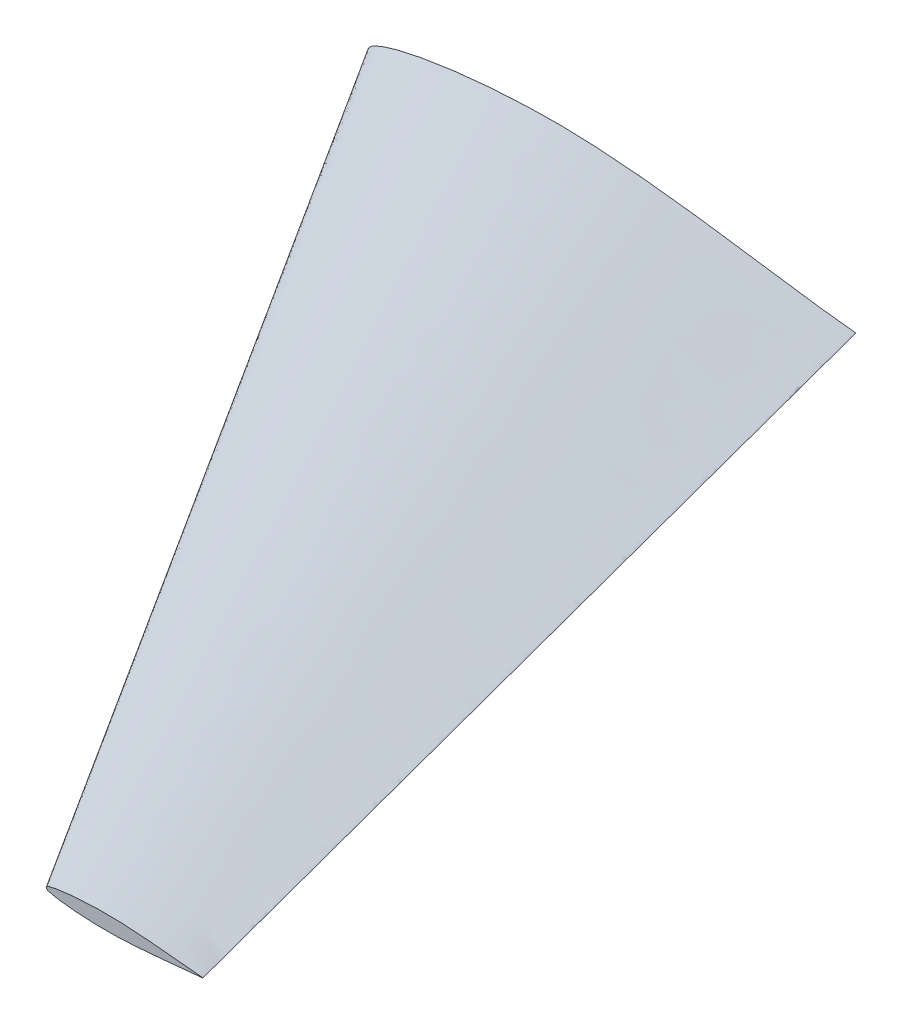
ISO-10303-21;
HEADER;
FILE_DESCRIPTION(('STEP AP214'),'2;1');
FILE_NAME('part.step','',(''),(''),'','','');
FILE_SCHEMA(('AUTOMOTIVE_DESIGN { 1 0 10303 214 1 1 1 1 }'));
ENDSEC;
DATA;
#1=APPLICATION_CONTEXT('core data for automotive mechanical design processes');
#2=APPLICATION_PROTOCOL_DEFINITION('international standard','automotive_design',2000,#1);
#3=PRODUCT_CONTEXT('',#1,'mechanical');
#4=PRODUCT('Part','Part','',(#3));
#5=PRODUCT_RELATED_PRODUCT_CATEGORY('part','',(#4));
#6=PRODUCT_DEFINITION_FORMATION('','',#4);
#7=PRODUCT_DEFINITION_CONTEXT('part definition',#1,'design');
#8=PRODUCT_DEFINITION('design','',#6,#7);
#9=PRODUCT_DEFINITION_SHAPE('','',#8);
#10=(LENGTH_UNIT() NAMED_UNIT(*) SI_UNIT(.MILLI.,.METRE.));
#11=(NAMED_UNIT(*) PLANE_ANGLE_UNIT() SI_UNIT($,.RADIAN.));
#12=(NAMED_UNIT(*) SI_UNIT($,.STERADIAN.) SOLID_ANGLE_UNIT());
#13=UNCERTAINTY_MEASURE_WITH_UNIT(LENGTH_MEASURE(1.E-05),#10,'distance_accuracy_value','');
#14=(GEOMETRIC_REPRESENTATION_CONTEXT(3) GLOBAL_UNCERTAINTY_ASSIGNED_CONTEXT((#13)) GLOBAL_UNIT_ASSIGNED_CONTEXT((#10,
#11,#12)) REPRESENTATION_CONTEXT('',''));
#15=CARTESIAN_POINT('',(0.,0.,0.));
#16=DIRECTION('',(0.,0.,1.));
#17=DIRECTION('',(1.,0.,0.));
#18=AXIS2_PLACEMENT_3D('',#15,#16,#17);
#19=CARTESIAN_POINT('',(4453.128,371.45976,6781.8));
#20=DIRECTION('',(0.,0.,-1.));
#21=DIRECTION('',(-1.,0.,0.));
#22=AXIS2_PLACEMENT_3D('',#19,#20,#21);
#23=PLANE('',#22);
#24=CARTESIAN_POINT('',(5588.08,371.45976,6781.8));
#25=CARTESIAN_POINT('',(5588.08,373.389033660394,6781.8));
#26=CARTESIAN_POINT('',(5522.56796665848,377.246958222847,6781.8));
#27=CARTESIAN_POINT('',(5476.93631004767,382.751113923314,6781.8));
#28=CARTESIAN_POINT('',(5417.20776513248,388.279371158532,6781.8));
#29=CARTESIAN_POINT('',(5361.25832589837,393.788419411056,6781.8));
#30=CARTESIAN_POINT('',(5304.30415938628,399.323068080224,6781.8));
#31=CARTESIAN_POINT('',(5247.62152230938,404.701403191757,6781.8));
#32=CARTESIAN_POINT('',(5190.86528711513,409.754791736413,6781.8));
#33=CARTESIAN_POINT('',(5134.12296543994,414.277198099908,6781.8));
#34=CARTESIAN_POINT('',(5077.37405739461,418.179025615403,6781.8));
#35=CARTESIAN_POINT('',(5020.62612912722,421.366617603054,6781.8));
#36=CARTESIAN_POINT('',(4963.873502372,423.62166755606,6781.8));
#37=CARTESIAN_POINT('',(4907.11371080945,424.783118391333,6781.8));
#38=CARTESIAN_POINT('',(4850.35264515862,424.405327799402,6781.8));
#39=CARTESIAN_POINT('',(4793.59626623108,423.014520922087,6781.8));
#40=CARTESIAN_POINT('',(4736.83720488456,420.590154546129,6781.8));
#41=CARTESIAN_POINT('',(4691.44477463074,417.780353043898,6781.8));
#42=CARTESIAN_POINT('',(4657.41011631619,415.120346995231,6781.8));
#43=CARTESIAN_POINT('',(4634.70927324186,413.121809072795,6781.8));
#44=CARTESIAN_POINT('',(4612.00715406554,410.886433711178,6781.8));
#45=CARTESIAN_POINT('',(4589.30249029939,408.381114500574,6781.8));
#46=CARTESIAN_POINT('',(4570.39022594525,406.014184388592,6781.8));
#47=CARTESIAN_POINT('',(4555.26575497689,403.898854811169,6781.8));
#48=CARTESIAN_POINT('',(4543.91478754129,402.200963084366,6781.8));
#49=CARTESIAN_POINT('',(4532.562761102,400.379871833449,6781.8));
#50=CARTESIAN_POINT('',(4521.20836085698,398.414733776014,6781.8));
#51=CARTESIAN_POINT('',(4509.85072092981,396.259854862085,6781.8));
#52=CARTESIAN_POINT('',(4498.48898179351,393.848808922471,6781.8));
#53=CARTESIAN_POINT('',(4487.10823225985,391.097498706532,6781.8));
#54=CARTESIAN_POINT('',(4475.6827064702,387.804436569271,6781.8));
#55=CARTESIAN_POINT('',(4467.94512337229,384.986164054341,6781.8));
#56=CARTESIAN_POINT('',(4463.90866818526,383.051037549598,6781.8));
#57=CARTESIAN_POINT('',(4463.3402459786,382.772373867734,6781.8));
#58=CARTESIAN_POINT('',(4462.77383813084,382.481228969844,6781.8));
#59=CARTESIAN_POINT('',(4462.20468037223,382.18506692914,6781.8));
#60=CARTESIAN_POINT('',(4461.6383932521,381.873595370281,6781.8));
#61=CARTESIAN_POINT('',(4461.06920179731,381.554932023186,6781.8));
#62=CARTESIAN_POINT('',(4460.50237042468,381.219330431199,6781.8));
#63=CARTESIAN_POINT('',(4459.93317268583,380.87163669184,6781.8));
#64=CARTESIAN_POINT('',(4459.36608721299,380.503126930761,6781.8));
#65=CARTESIAN_POINT('',(4458.79624417143,380.116974740003,6781.8));
#66=CARTESIAN_POINT('',(4458.22908740877,379.702707947539,6781.8));
#67=CARTESIAN_POINT('',(4457.65978663277,379.262562113939,6781.8));
#68=CARTESIAN_POINT('',(4457.08950106512,378.788749250087,6781.8));
#69=CARTESIAN_POINT('',(4456.51963706104,378.270985507122,6781.8));
#70=CARTESIAN_POINT('',(4456.0521212618,377.801218074383,6781.8));
#71=CARTESIAN_POINT('',(4455.67541266046,377.398000449587,6781.8));
#72=CARTESIAN_POINT('',(4455.39345946141,377.067902590402,6781.8));
#73=CARTESIAN_POINT('',(4455.10588602049,376.717223822734,6781.8));
#74=CARTESIAN_POINT('',(4454.82351786847,376.334358412567,6781.8));
#75=CARTESIAN_POINT('',(4454.533910329,375.917381821102,6781.8));
#76=CARTESIAN_POINT('',(4454.250165846,375.447179964608,6781.8));
#77=CARTESIAN_POINT('',(4453.95907316831,374.908874378052,6781.8));
#78=CARTESIAN_POINT('',(4453.65957079658,374.248591593124,6781.8));
#79=CARTESIAN_POINT('',(4453.27379611439,373.110554852125,6781.8));
#80=CARTESIAN_POINT('',(4453.026428463,371.45976,6781.8));
#81=CARTESIAN_POINT('',(4453.27379611439,369.808965147876,6781.8));
#82=CARTESIAN_POINT('',(4453.65957079658,368.670928406876,6781.8));
#83=CARTESIAN_POINT('',(4453.95907316831,368.010645621949,6781.8));
#84=CARTESIAN_POINT('',(4454.250165846,367.472340035392,6781.8));
#85=CARTESIAN_POINT('',(4454.533910329,367.002138178898,6781.8));
#86=CARTESIAN_POINT('',(4454.82351786847,366.585161587433,6781.8));
#87=CARTESIAN_POINT('',(4455.10588602049,366.202296177266,6781.8));
#88=CARTESIAN_POINT('',(4455.39345946141,365.851617409598,6781.8));
#89=CARTESIAN_POINT('',(4455.67541266046,365.521519550413,6781.8));
#90=CARTESIAN_POINT('',(4456.0521212618,365.118301925617,6781.8));
#91=CARTESIAN_POINT('',(4456.51963706104,364.648534492878,6781.8));
#92=CARTESIAN_POINT('',(4457.08950106512,364.130770749913,6781.8));
#93=CARTESIAN_POINT('',(4457.65978663277,363.656957886061,6781.8));
#94=CARTESIAN_POINT('',(4458.22908740877,363.216812052461,6781.8));
#95=CARTESIAN_POINT('',(4458.79624417143,362.802545259997,6781.8));
#96=CARTESIAN_POINT('',(4459.36608721299,362.416393069239,6781.8));
#97=CARTESIAN_POINT('',(4459.93317268583,362.047883308161,6781.8));
#98=CARTESIAN_POINT('',(4460.50237042468,361.700189568801,6781.8));
#99=CARTESIAN_POINT('',(4461.06920179731,361.364587976814,6781.8));
#100=CARTESIAN_POINT('',(4461.6383932521,361.045924629719,6781.8));
#101=CARTESIAN_POINT('',(4462.20468037223,360.73445307086,6781.8));
#102=CARTESIAN_POINT('',(4462.77383813084,360.438291030156,6781.8));
#103=CARTESIAN_POINT('',(4463.3402459786,360.147146132266,6781.8));
#104=CARTESIAN_POINT('',(4463.90866818526,359.868482450402,6781.8));
#105=CARTESIAN_POINT('',(4467.94512337229,357.933355945659,6781.8));
#106=CARTESIAN_POINT('',(4475.6827064702,355.115083430729,6781.8));
#107=CARTESIAN_POINT('',(4487.10823225985,351.822021293468,6781.8));
#108=CARTESIAN_POINT('',(4498.48898179351,349.070711077529,6781.8));
#109=CARTESIAN_POINT('',(4509.85072092981,346.659665137915,6781.8));
#110=CARTESIAN_POINT('',(4521.20836085698,344.504786223986,6781.8));
#111=CARTESIAN_POINT('',(4532.562761102,342.539648166551,6781.8));
#112=CARTESIAN_POINT('',(4543.91478754129,340.718556915634,6781.8));
#113=CARTESIAN_POINT('',(4555.26575497689,339.020665188831,6781.8));
#114=CARTESIAN_POINT('',(4570.39022594525,336.905335611408,6781.8));
#115=CARTESIAN_POINT('',(4589.30249029939,334.538405499426,6781.8));
#116=CARTESIAN_POINT('',(4612.00715406554,332.033086288822,6781.8));
#117=CARTESIAN_POINT('',(4634.70927324186,329.797710927205,6781.8));
#118=CARTESIAN_POINT('',(4657.41011631619,327.799173004769,6781.8));
#119=CARTESIAN_POINT('',(4691.44477463074,325.139166956102,6781.8));
#120=CARTESIAN_POINT('',(4736.83720488456,322.329365453871,6781.8));
#121=CARTESIAN_POINT('',(4793.59626623108,319.904999077913,6781.8));
#122=CARTESIAN_POINT('',(4850.35264515862,318.514192200598,6781.8));
#123=CARTESIAN_POINT('',(4907.11371080946,318.136401608667,6781.8));
#124=CARTESIAN_POINT('',(4963.873502372,319.29785244394,6781.8));
#125=CARTESIAN_POINT('',(5020.62612912722,321.552902396946,6781.8));
#126=CARTESIAN_POINT('',(5077.37405739461,324.740494384597,6781.8));
#127=CARTESIAN_POINT('',(5134.12296543994,328.642321900092,6781.8));
#128=CARTESIAN_POINT('',(5190.86528711513,333.164728263587,6781.8));
#129=CARTESIAN_POINT('',(5247.62152230938,338.218116808243,6781.8));
#130=CARTESIAN_POINT('',(5304.30415938628,343.596451919776,6781.8));
#131=CARTESIAN_POINT('',(5361.25832589837,349.131100588944,6781.8));
#132=CARTESIAN_POINT('',(5417.20776513248,354.640148841468,6781.8));
#133=CARTESIAN_POINT('',(5476.93631004767,360.168406076686,6781.8));
#134=CARTESIAN_POINT('',(5522.56796665848,365.672561777153,6781.8));
#135=CARTESIAN_POINT('',(5588.08,369.530486339606,6781.8));
#136=CARTESIAN_POINT('',(5588.08,371.45976,6781.8));
#137=B_SPLINE_CURVE_WITH_KNOTS('',3,(#24,#25,#26,#27,#28,#29,#30,#31,#32,#33,#34,#35,#36,#37,
#38,#39,#40,#41,#42,#43,#44,#45,#46,#47,#48,#49,#50,#51,#52,#53,#54,#55,#56,#57,#58,#59,#60,#61,
#62,#63,#64,#65,#66,#67,#68,#69,#70,#71,#72,#73,#74,#75,#76,#77,#78,#79,#80,#81,#82,#83,#84,#85,
#86,#87,#88,#89,#90,#91,#92,#93,#94,#95,#96,#97,#98,#99,#100,#101,#102,#103,#104,#105,#106,#107,
#108,#109,#110,#111,#112,#113,#114,#115,#116,#117,#118,#119,#120,#121,#122,#123,#124,#125,#126,
#127,#128,#129,#130,#131,#132,#133,#134,#135,#136),.UNSPECIFIED.,.T.,.F.,(4,1,1,1,1,1,1,1,1,1,1,
1,1,1,1,1,1,1,1,1,1,1,1,1,1,1,1,1,1,1,1,1,1,1,1,1,1,1,1,1,1,1,1,1,1,1,1,1,1,1,1,1,1,1,1,1,1,1,1,
1,1,1,1,1,1,1,1,1,1,1,1,1,1,1,1,1,1,1,1,1,1,1,1,1,1,1,1,1,1,1,1,1,1,1,1,1,1,1,1,1,1,1,1,1,1,1,1,
1,1,1,4),(0.,0.0248728361048648,0.0497376434026737,0.0746010109773868,0.0994641990756578,
0.124326894656901,0.149183194473856,0.174026342593584,0.198850813633184,0.223655297882157,
0.248439944807249,0.273205536236026,0.297956604956432,0.322703459421333,0.347457453436331,
0.372226713137249,0.397021626497709,0.406950497379767,0.416887471422196,0.426834182798912,
0.436793395190354,0.446770197832636,0.451767659018878,0.456772162196694,0.461784975770895,
0.466808410317839,0.471846872423134,0.476907531137721,0.482002495778416,0.48715930915511,
0.492465043602838,0.492739458221822,0.49301528992154,0.493293198501541,0.493572598437392,
0.493854621811579,0.494138668553901,0.494425954793457,0.494716346128536,0.495011186359694,
0.495310641640689,0.49561676788038,0.495929851719096,0.496251932842065,0.496586489498024,
0.496936724203302,0.497118685789417,0.497308246799241,0.497504559738857,0.497711847688885,
0.497930443482382,0.498168495270237,0.498429874845139,0.498730742425582,0.499115748432514,0.5,
0.500884251567486,0.501269257574419,0.501570125154861,0.501831504729763,0.502069556517618,
0.502288152311115,0.502495440261143,0.502691753200759,0.502881314210583,0.503063275796698,
0.503413510501976,0.503748067157936,0.504070148280904,0.50438323211962,0.504689358359311,
0.504988813640306,0.505283653871464,0.505574045206543,0.505861331446099,0.506145378188421,
0.506427401562608,0.50670680149846,0.50698471007846,0.507260541778178,0.507534956397162,
0.51284069084489,0.517997504221584,0.523092468862279,0.528153127576867,0.533191589682161,
0.538215024229105,0.543227837803307,0.548232340981122,0.553229802167364,0.563206604809646,
0.573165817201088,0.583112528577804,0.593049502620234,0.602978373502291,0.627773286862751,
0.652542546563669,0.677296540578667,0.702043395043568,0.726794463763974,0.751560055192752,
0.776344702117843,0.801149186366816,0.825973657406416,0.850816805526144,0.875673105343099,
0.900535800924342,0.925398989022613,0.950262356597326,0.975127163895135,1.),.UNSPECIFIED.);
#138=CARTESIAN_POINT('',(5588.08,371.45976,6781.8));
#139=VERTEX_POINT('',#138);
#140=EDGE_CURVE('E11',#139,#139,#137,.T.);
#141=ORIENTED_EDGE('',*,*,#140,.T.);
#142=EDGE_LOOP('',(#141));
#143=FACE_BOUND('',#142,.T.);
#144=ADVANCED_FACE('F57',(#143),#23,.F.);
#145=CARTESIAN_POINT('',(1.41663784686164,12.530424946745,0.));
#146=DIRECTION('',(0.,0.,-1.));
#147=DIRECTION('',(-1.,0.,0.));
#148=AXIS2_PLACEMENT_3D('',#145,#146,#147);
#149=PLANE('',#148);
#150=CARTESIAN_POINT('',(3535.68,0.,0.));
#151=CARTESIAN_POINT('',(3535.90189872487,2.63829126816146,0.));
#152=CARTESIAN_POINT('',(3331.70297207679,21.1749690907398,0.));
#153=CARTESIAN_POINT('',(3190.29906148056,42.7113676696929,0.));
#154=CARTESIAN_POINT('',(3004.59722930479,68.4144807731065,0.));
#155=CARTESIAN_POINT('',(2830.62327576356,94.066667467642,0.));
#156=CARTESIAN_POINT('',(2653.31200758979,119.73726453333,0.));
#157=CARTESIAN_POINT('',(2476.66788545372,144.168342436575,0.));
#158=CARTESIAN_POINT('',(2299.64955800253,166.977592413341,0.));
#159=CARTESIAN_POINT('',(2122.54902271198,187.537852911455,0.));
#160=CARTESIAN_POINT('',(1945.30408940062,205.336102073689,0.));
#161=CARTESIAN_POINT('',(1767.95840609524,219.868092541268,0.));
#162=CARTESIAN_POINT('',(1590.49777308077,230.255002670067,0.));
#163=CARTESIAN_POINT('',(1412.94251825459,236.129536966388,0.));
#164=CARTESIAN_POINT('',(1235.34474684173,234.021604668797,0.));
#165=CARTESIAN_POINT('',(1057.80763050715,227.785396112693,0.));
#166=CARTESIAN_POINT('',(880.296939472491,216.258771913648,0.));
#167=CARTESIAN_POINT('',(702.826460894581,199.620210892244,0.));
#168=CARTESIAN_POINT('',(525.373069263671,177.321363917864,0.));
#169=CARTESIAN_POINT('',(377.768290785376,152.672611783651,0.));
#170=CARTESIAN_POINT('',(259.987114109003,127.558896590805,0.));
#171=CARTESIAN_POINT('',(171.268168065601,104.876001920985,0.));
#172=CARTESIAN_POINT('',(97.6695715470451,80.3410033380585,0.));
#173=CARTESIAN_POINT('',(48.094160217702,58.4887731370571,0.));
#174=CARTESIAN_POINT('',(25.6388646562268,43.5402843898587,0.));
#175=CARTESIAN_POINT('',(7.9891598626233,29.0691975734642,0.));
#176=CARTESIAN_POINT('',(-8.18769503407777,-0.861606188277735,0.));
#177=CARTESIAN_POINT('',(13.2485294153797,-26.5107817454229,0.));
#178=CARTESIAN_POINT('',(32.2445449800642,-38.5405965089913,0.));
#179=CARTESIAN_POINT('',(55.8787689156297,-50.2342411136413,0.));
#180=CARTESIAN_POINT('',(106.480941869488,-66.3384382901001,0.));
#181=CARTESIAN_POINT('',(180.799172646838,-83.6767371755155,0.));
#182=CARTESIAN_POINT('',(269.69970347176,-99.1932561780486,0.));
#183=CARTESIAN_POINT('',(387.450455754877,-116.146068209525,0.));
#184=CARTESIAN_POINT('',(534.551583192847,-132.143631228252,0.));
#185=CARTESIAN_POINT('',(710.986169304082,-146.389812556259,0.));
#186=CARTESIAN_POINT('',(887.251264817481,-156.4153618934,0.));
#187=CARTESIAN_POINT('',(1063.42610129209,-162.853778249306,0.));
#188=CARTESIAN_POINT('',(1239.56331836936,-165.251372761652,0.));
#189=CARTESIAN_POINT('',(1415.70804653315,-164.616456946277,0.));
#190=CARTESIAN_POINT('',(1591.82849470851,-157.15881125229,0.));
#191=CARTESIAN_POINT('',(1767.96880719468,-146.236443969616,0.));
#192=CARTESIAN_POINT('',(1944.18866572364,-132.241548793469,0.));
#193=CARTESIAN_POINT('',(2120.49765552944,-116.023545517052,0.));
#194=CARTESIAN_POINT('',(2296.90685210007,-98.1987573543768,0.));
#195=CARTESIAN_POINT('',(2473.49041144207,-79.2363943518668,0.));
#196=CARTESIAN_POINT('',(2649.98428106266,-59.8569241736472,0.));
#197=CARTESIAN_POINT('',(2827.46894811629,-40.8939518277458,0.));
#198=CARTESIAN_POINT('',(3001.92890884679,-22.8797459698845,0.));
#199=CARTESIAN_POINT('',(3188.37739960557,-9.0555006296165,0.));
#200=CARTESIAN_POINT('',(3330.90617498141,5.31066374864862,0.));
#201=CARTESIAN_POINT('',(3535.45837811298,-2.63499977159703,0.));
#202=CARTESIAN_POINT('',(3535.68,0.,0.));
#203=B_SPLINE_CURVE_WITH_KNOTS('',3,(#150,#151,#152,#153,#154,#155,#156,#157,#158,#159,#160,
#161,#162,#163,#164,#165,#166,#167,#168,#169,#170,#171,#172,#173,#174,#175,#176,#177,#178,#179,
#180,#181,#182,#183,#184,#185,#186,#187,#188,#189,#190,#191,#192,#193,#194,#195,#196,#197,#198,
#199,#200,#201,#202),.UNSPECIFIED.,.T.,.F.,(4,1,1,1,1,1,1,1,1,1,1,1,1,1,1,1,1,1,1,1,1,1,1,1,1,1,
1,1,1,1,1,1,1,1,1,1,1,1,1,1,1,1,1,1,1,1,1,1,1,1,4),(0.,0.0247454681477494,0.0495398996369472,
0.0743817259923836,0.0992562689316587,0.124151216503441,0.149044304841186,0.173926325969112,
0.198790270355659,0.223627633639443,0.248437875453968,0.273218608133148,0.297983306691575,
0.322732914165591,0.347497893490832,0.372288594181354,0.397132127318429,0.422050329912353,
0.44709002384007,0.459701789467785,0.472419622979444,0.485375863821892,0.492120521315315,
0.495018520629382,0.496585325627309,0.501771047727381,0.506935810153675,0.508461838732941,
0.511288434662432,0.5178910463761,0.530641760655256,0.543182802086977,0.555631936995407,
0.5804010666938,0.605063517362419,0.629670378915391,0.654247803751555,0.678801969293769,
0.703354166271279,0.727919604517398,0.75252761478392,0.777174683214315,0.801863225585522,
0.826588226962813,0.851348639697228,0.876134630911943,0.90093475395833,0.925739469500797,
0.950527792633415,0.975285403964203,1.),.UNSPECIFIED.);
#204=CARTESIAN_POINT('',(3535.68,0.,0.));
#205=VERTEX_POINT('',#204);
#206=EDGE_CURVE('E67',#205,#205,#203,.T.);
#207=ORIENTED_EDGE('',*,*,#206,.F.);
#208=EDGE_LOOP('',(#207));
#209=FACE_BOUND('',#208,.T.);
#210=ADVANCED_FACE('F95',(#209),#149,.T.);
#211=CARTESIAN_POINT('',(0.608652731856289,-3.67429922377359,0.));
#212=CARTESIAN_POINT('',(4453.81249802518,374.579657386319,6781.8));
#213=CARTESIAN_POINT('',(0.678621463767058,-3.97420502773726,0.));
#214=CARTESIAN_POINT('',(4453.77182416895,374.488337018754,6781.8));
#215=CARTESIAN_POINT('',(0.973320775721675,-5.15428147173112,0.));
#216=CARTESIAN_POINT('',(4453.6177715952,374.125283794266,6781.8));
#217=CARTESIAN_POINT('',(1.96834263278792,-8.3238426338033,0.));
#218=CARTESIAN_POINT('',(4453.27379611439,373.110554852125,6781.8));
#219=CARTESIAN_POINT('',(4.18088147268048,-13.0511841039498,0.));
#220=CARTESIAN_POINT('',(4453.026428463,371.45976,6781.8));
#221=CARTESIAN_POINT('',(7.1630381269557,-17.506992610696,0.));
#222=CARTESIAN_POINT('',(4453.27379611439,369.808965147876,6781.8));
#223=CARTESIAN_POINT('',(9.64554824882876,-20.5795637123299,0.));
#224=CARTESIAN_POINT('',(4453.65957079658,368.670928406876,6781.8));
#225=CARTESIAN_POINT('',(11.2303076290926,-22.3709724860053,0.));
#226=CARTESIAN_POINT('',(4453.95907316831,368.010645621949,6781.8));
#227=CARTESIAN_POINT('',(12.6222518795374,-23.8387245907382,0.));
#228=CARTESIAN_POINT('',(4454.250165846,367.472340035392,6781.8));
#229=CARTESIAN_POINT('',(13.9083465288118,-25.1173223851397,0.));
#230=CARTESIAN_POINT('',(4454.533910329,367.002138178898,6781.8));
#231=CARTESIAN_POINT('',(15.1251725611509,-26.2658497076401,0.));
#232=CARTESIAN_POINT('',(4454.82351786847,366.585161587433,6781.8));
#233=CARTESIAN_POINT('',(16.2865332374387,-27.3115572207673,0.));
#234=CARTESIAN_POINT('',(4455.10588602049,366.202296177266,6781.8));
#235=CARTESIAN_POINT('',(17.4100386712124,-28.2798464374507,0.));
#236=CARTESIAN_POINT('',(4455.39345946141,365.851617409598,6781.8));
#237=CARTESIAN_POINT('',(18.4982216457716,-29.1797656428265,0.));
#238=CARTESIAN_POINT('',(4455.67541266046,365.521519550413,6781.8));
#239=CARTESIAN_POINT('',(19.5504489643286,-30.0163271813849,0.));
#240=CARTESIAN_POINT('',(4455.95937367205,365.217576172898,6781.8));
#241=CARTESIAN_POINT('',(20.5868686666128,-30.8100253247071,0.));
#242=CARTESIAN_POINT('',(4456.24333198011,364.926170304825,6781.8));
#243=CARTESIAN_POINT('',(21.9273045690573,-31.7991919692659,0.));
#244=CARTESIAN_POINT('',(4456.61728708172,364.559812201518,6781.8));
#245=CARTESIAN_POINT('',(23.5730946172157,-32.9515764454818,0.));
#246=CARTESIAN_POINT('',(4457.08950106512,364.130770749913,6781.8));
#247=CARTESIAN_POINT('',(25.5059404620786,-34.2246716751308,0.));
#248=CARTESIAN_POINT('',(4457.65978663277,363.656957886061,6781.8));
#249=CARTESIAN_POINT('',(27.4019773672615,-35.4094019772627,0.));
#250=CARTESIAN_POINT('',(4458.22908740877,363.216812052461,6781.8));
#251=CARTESIAN_POINT('',(28.8102213889488,-36.2512097915382,0.));
#252=CARTESIAN_POINT('',(4458.65611659075,362.904898272793,6781.8));
#253=CARTESIAN_POINT('',(30.0515621069126,-36.9768995240804,0.));
#254=CARTESIAN_POINT('',(4459.03585004839,362.640177155875,6781.8));
#255=CARTESIAN_POINT('',(31.276368237767,-37.6810272794362,0.));
#256=CARTESIAN_POINT('',(4459.41254723043,362.386201906276,6781.8));
#257=CARTESIAN_POINT('',(32.9651785668881,-38.6245020302436,0.));
#258=CARTESIAN_POINT('',(4459.93317268583,362.047883308161,6781.8));
#259=CARTESIAN_POINT('',(34.7960747713214,-39.6158189093656,0.));
#260=CARTESIAN_POINT('',(4460.50237042468,361.700189568801,6781.8));
#261=CARTESIAN_POINT('',(36.6193606344454,-40.5736725142111,0.));
#262=CARTESIAN_POINT('',(4461.06920179731,361.364587976814,6781.8));
#263=CARTESIAN_POINT('',(38.43848473376,-41.5019051516847,0.));
#264=CARTESIAN_POINT('',(4461.6383932521,361.045924629719,6781.8));
#265=CARTESIAN_POINT('',(40.2529416294841,-42.4020443549952,0.));
#266=CARTESIAN_POINT('',(4462.20468037223,360.73445307086,6781.8));
#267=CARTESIAN_POINT('',(42.0650577567866,-43.2768555171151,0.));
#268=CARTESIAN_POINT('',(4462.77383813084,360.438291030156,6781.8));
#269=CARTESIAN_POINT('',(43.8733816157711,-44.1271070839495,0.));
#270=CARTESIAN_POINT('',(4463.3402459786,360.147146132266,6781.8));
#271=CARTESIAN_POINT('',(45.6792635066553,-44.9547925057757,0.));
#272=CARTESIAN_POINT('',(4463.90866818526,359.868482450402,6781.8));
#273=CARTESIAN_POINT('',(47.0010445777869,-45.54580406268,0.));
#274=CARTESIAN_POINT('',(4464.32480808076,359.668979841268,6781.8));
#275=CARTESIAN_POINT('',(59.2430062017883,-50.9419042718891,0.));
#276=CARTESIAN_POINT('',(4468.18141910716,357.847289564651,6781.8));
#277=CARTESIAN_POINT('',(74.3101896087843,-56.1000610134207,0.));
#278=CARTESIAN_POINT('',(4472.97859286412,356.101906366675,6781.8));
#279=CARTESIAN_POINT('',(98.1954238912858,-63.1423690841905,0.));
#280=CARTESIAN_POINT('',(4480.57097687145,353.706187378904,6781.8));
#281=CARTESIAN_POINT('',(121.852748593006,-69.5798586465711,0.));
#282=CARTESIAN_POINT('',(4488.11186468876,351.579391917735,6781.8));
#283=CARTESIAN_POINT('',(151.511069973835,-76.6584514022527,0.));
#284=CARTESIAN_POINT('',(4497.58865065865,349.288367238201,6781.8));
#285=CARTESIAN_POINT('',(175.265891221448,-81.705682632018,0.));
#286=CARTESIAN_POINT('',(4505.17726248136,347.651407940749,6781.8));
#287=CARTESIAN_POINT('',(198.939901346021,-86.4571172817403,0.));
#288=CARTESIAN_POINT('',(4512.74169200491,346.111162750935,6781.8));
#289=CARTESIAN_POINT('',(225.433208250342,-91.4083664148963,0.));
#290=CARTESIAN_POINT('',(4521.20836085698,344.504786223986,6781.8));
#291=CARTESIAN_POINT('',(252.14122957142,-95.9247079917906,0.));
#292=CARTESIAN_POINT('',(4529.74196827557,343.027850732581,6781.8));
#293=CARTESIAN_POINT('',(275.831263001888,-99.7320426639918,0.));
#294=CARTESIAN_POINT('',(4537.31106177681,341.777926119667,6781.8));
#295=CARTESIAN_POINT('',(299.498426414212,-103.390661330475,0.));
#296=CARTESIAN_POINT('',(4544.87321031832,340.575194853049,6781.8));
#297=CARTESIAN_POINT('',(328.953629819764,-107.650451650974,0.));
#298=CARTESIAN_POINT('',(4554.28458659895,339.167429566489,6781.8));
#299=CARTESIAN_POINT('',(352.647658575713,-110.864866149846,0.));
#300=CARTESIAN_POINT('',(4561.85499521772,338.099084870197,6781.8));
#301=CARTESIAN_POINT('',(388.142400398546,-115.512046429082,0.));
#302=CARTESIAN_POINT('',(4573.19640255649,336.554133671951,6781.8));
#303=CARTESIAN_POINT('',(438.541934898396,-121.584205729376,0.));
#304=CARTESIAN_POINT('',(4589.30249029939,334.538405499426,6781.8));
#305=CARTESIAN_POINT('',(494.350906160382,-127.448480375811,0.));
#306=CARTESIAN_POINT('',(4607.13577505043,332.570612832019,6781.8));
#307=CARTESIAN_POINT('',(541.720662316088,-132.029346621459,0.));
#308=CARTESIAN_POINT('',(4622.27267465387,331.02228674103,6781.8));
#309=CARTESIAN_POINT('',(589.060867665374,-136.340600752258,0.));
#310=CARTESIAN_POINT('',(4637.40119751456,329.560719167661,6781.8));
#311=CARTESIAN_POINT('',(647.822162290829,-141.168448146516,0.));
#312=CARTESIAN_POINT('',(4656.18048020339,327.907427768444,6781.8));
#313=CARTESIAN_POINT('',(695.188382910564,-144.617497666234,0.));
#314=CARTESIAN_POINT('',(4671.31866133434,326.712139501024,6781.8));
#315=CARTESIAN_POINT('',(773.707586379006,-149.957261117465,0.));
#316=CARTESIAN_POINT('',(4696.41392231313,324.848562308342,6781.8));
#317=CARTESIAN_POINT('',(836.747157208348,-153.500684052358,0.));
#318=CARTESIAN_POINT('',(4716.56298143312,323.584344382999,6781.8));
#319=CARTESIAN_POINT('',(950.349101853345,-158.721310655002,0.));
#320=CARTESIAN_POINT('',(4752.87425275897,321.660025906265,6781.8));
#321=CARTESIAN_POINT('',(1013.83616867094,-160.988028888273,0.));
#322=CARTESIAN_POINT('',(4773.16743631911,320.777581660567,6781.8));
#323=CARTESIAN_POINT('',(1126.9454700626,-163.718409203053,0.));
#324=CARTESIAN_POINT('',(4809.32377150574,319.536082604938,6781.8));
#325=CARTESIAN_POINT('',(1190.88745154026,-164.544065971656,0.));
#326=CARTESIAN_POINT('',(4829.7643114909,319.018706346824,6781.8));
#327=CARTESIAN_POINT('',(1303.51789703237,-165.020847704887,0.));
#328=CARTESIAN_POINT('',(4865.77185475979,318.429301997123,6781.8));
#329=CARTESIAN_POINT('',(1367.93068462273,-164.677272877426,0.));
#330=CARTESIAN_POINT('',(4886.36660735527,318.274490286266,6781.8));
#331=CARTESIAN_POINT('',(1480.06741492091,-161.891223326347,0.));
#332=CARTESIAN_POINT('',(4922.23353634378,318.475059627195,6781.8));
#333=CARTESIAN_POINT('',(1544.89816697778,-159.084152683616,0.));
#334=CARTESIAN_POINT('',(4942.97712694883,318.870259036331,6781.8));
#335=CARTESIAN_POINT('',(1656.58692067846,-153.143175631415,0.));
#336=CARTESIAN_POINT('',(4978.72425834614,319.910166031207,6781.8));
#337=CARTESIAN_POINT('',(1721.81878448217,-149.038889099398,0.));
#338=CARTESIAN_POINT('',(4999.60810066438,320.717756839687,6781.8));
#339=CARTESIAN_POINT('',(1833.1256155944,-141.061869939321,0.));
#340=CARTESIAN_POINT('',(5035.25056039715,322.3943818889,6781.8));
#341=CARTESIAN_POINT('',(1898.69947510696,-135.808573173784,0.));
#342=CARTESIAN_POINT('',(5056.25272622937,323.554086562383,6781.8));
#343=CARTESIAN_POINT('',(2009.6959539798,-126.215778827129,0.));
#344=CARTESIAN_POINT('',(5091.80835319752,325.748944227761,6781.8));
#345=CARTESIAN_POINT('',(2075.57431120401,-120.121255678568,0.));
#346=CARTESIAN_POINT('',(5112.91432090162,327.184100487975,6781.8));
#347=CARTESIAN_POINT('',(2186.31640240911,-109.37306899389,0.));
#348=CARTESIAN_POINT('',(5148.39502998106,329.794247467209,6781.8));
#349=CARTESIAN_POINT('',(2252.45713385011,-102.664754118984,0.));
#350=CARTESIAN_POINT('',(5169.58574328187,331.468732371937,6781.8));
#351=CARTESIAN_POINT('',(2363.02738686546,-91.0984271378299,0.));
#352=CARTESIAN_POINT('',(5205.00795975662,334.436617624704,6781.8));
#353=CARTESIAN_POINT('',(2429.42254444435,-83.9586238201338,0.));
#354=CARTESIAN_POINT('',(5226.278533571,336.317807275201,6781.8));
#355=CARTESIAN_POINT('',(2539.79105927368,-71.9564166947874,0.));
#356=CARTESIAN_POINT('',(5261.63456265844,339.55587839701,6781.8));
#357=CARTESIAN_POINT('',(2606.34065336435,-64.6617475400159,0.));
#358=CARTESIAN_POINT('',(5282.94146316864,341.569451323659,6781.8));
#359=CARTESIAN_POINT('',(2716.84619089532,-52.7132054051537,0.));
#360=CARTESIAN_POINT('',(5318.29805151448,344.959590859376,6781.8));
#361=CARTESIAN_POINT('',(2783.81637613192,-45.5733459555893,0.));
#362=CARTESIAN_POINT('',(5339.75090336932,347.041068642776,6781.8));
#363=CARTESIAN_POINT('',(2893.36921238232,-34.0892906229345,0.));
#364=CARTESIAN_POINT('',(5374.88598451949,350.474815606404,6781.8));
#365=CARTESIAN_POINT('',(2959.72216517108,-27.3747449955456,0.));
#366=CARTESIAN_POINT('',(5396.03776167855,352.555649476858,6781.8));
#367=CARTESIAN_POINT('',(3072.55612086034,-17.6430830041453,0.));
#368=CARTESIAN_POINT('',(5431.77520173009,355.979818675477,6781.8));
#369=CARTESIAN_POINT('',(3142.20443170099,-12.3811176869923,0.));
#370=CARTESIAN_POINT('',(5454.27577402552,358.071029145836,6781.8));
#371=CARTESIAN_POINT('',(3242.54579173191,-3.5956064900554,0.));
#372=CARTESIAN_POINT('',(5487.49631295415,361.487463996754,6781.8));
#373=CARTESIAN_POINT('',(3301.213449855,1.18346733685311,0.));
#374=CARTESIAN_POINT('',(5505.1874369297,363.576097416902,6781.8));
#375=CARTESIAN_POINT('',(3447.91528064245,0.765540459072155,0.));
#376=CARTESIAN_POINT('',(5547.27141220317,367.047501055924,6781.8));
#377=CARTESIAN_POINT('',(3548.6008912731,-2.709947246304,0.));
#378=CARTESIAN_POINT('',(5583.2065378323,369.243494035415,6781.8));
#379=CARTESIAN_POINT('',(3520.65083777495,4.02274518239945,0.));
#380=CARTESIAN_POINT('',(5592.20354636126,372.805169694313,6781.8));
#381=CARTESIAN_POINT('',(3407.61558260874,14.533416092784,0.));
#382=CARTESIAN_POINT('',(5560.35992086896,375.021435658898,6781.8));
#383=CARTESIAN_POINT('',(3277.38437825151,29.4479148808317,0.));
#384=CARTESIAN_POINT('',(5513.66537072511,378.503629893597,6781.8));
#385=CARTESIAN_POINT('',(3221.53088777493,37.8780241106024,0.));
#386=CARTESIAN_POINT('',(5494.52879491196,380.629083231396,6781.8));
#387=CARTESIAN_POINT('',(3118.79010629434,52.6089693331954,0.));
#388=CARTESIAN_POINT('',(5462.8568384877,384.015345435857,6781.8));
#389=CARTESIAN_POINT('',(3047.47134705166,62.5277641047807,0.));
#390=CARTESIAN_POINT('',(5440.25514177127,386.146189664874,6781.8));
#391=CARTESIAN_POINT('',(2937.5338874625,78.3028653863257,0.));
#392=CARTESIAN_POINT('',(5404.54349021987,389.537057596942,6781.8));
#393=CARTESIAN_POINT('',(2870.32305112243,88.1986182597021,0.));
#394=CARTESIAN_POINT('',(5382.83918840515,391.663464907339,6781.8));
#395=CARTESIAN_POINT('',(2762.26966566262,103.962699462444,0.));
#396=CARTESIAN_POINT('',(5348.18525560071,395.056658637874,6781.8));
#397=CARTESIAN_POINT('',(2693.96490466145,113.817093564989,0.));
#398=CARTESIAN_POINT('',(5326.24513484307,397.190904657441,6781.8));
#399=CARTESIAN_POINT('',(2585.25042941019,129.150641545912,0.));
#400=CARTESIAN_POINT('',(5291.27566215119,400.555394559459,6781.8));
#401=CARTESIAN_POINT('',(2517.26686424693,138.503065986284,0.));
#402=CARTESIAN_POINT('',(5269.42579804369,402.63250329911,6781.8));
#403=CARTESIAN_POINT('',(2408.52545300882,152.948663649864,0.));
#404=CARTESIAN_POINT('',(5234.50600744596,405.859415420545,6781.8));
#405=CARTESIAN_POINT('',(2340.4950999346,161.64748615553,0.));
#406=CARTESIAN_POINT('',(5212.66524310986,407.813795341555,6781.8));
#407=CARTESIAN_POINT('',(2231.54312830559,174.884321401305,0.));
#408=CARTESIAN_POINT('',(5177.69646945661,410.788946961547,6781.8));
#409=CARTESIAN_POINT('',(2163.56410570776,182.694641365834,0.));
#410=CARTESIAN_POINT('',(5155.88743705347,412.542553093901,6781.8));
#411=CARTESIAN_POINT('',(2054.45829795379,194.375259556837,0.));
#412=CARTESIAN_POINT('',(5120.90060070133,415.168423015745,6781.8));
#413=CARTESIAN_POINT('',(1986.50033146031,201.104090106959,0.));
#414=CARTESIAN_POINT('',(5099.11796545105,416.684001628664,6781.8));
#415=CARTESIAN_POINT('',(1877.24017078056,210.913369014376,0.));
#416=CARTESIAN_POINT('',(5064.11229590692,418.903524026268,6781.8));
#417=CARTESIAN_POINT('',(1809.29355920864,216.361274827025,0.));
#418=CARTESIAN_POINT('',(5042.35280250465,420.146207059609,6781.8));
#419=CARTESIAN_POINT('',(1699.90962674808,223.85104100396,0.));
#420=CARTESIAN_POINT('',(5007.33773426442,421.868056716304,6781.8));
#421=CARTESIAN_POINT('',(1631.9605597147,227.698801902788,0.));
#422=CARTESIAN_POINT('',(4985.59493747172,422.758572330316,6781.8));
#423=CARTESIAN_POINT('',(1522.46385248114,232.505950411754,0.));
#424=CARTESIAN_POINT('',(4950.56951439992,423.862846809207,6781.8));
#425=CARTESIAN_POINT('',(1454.49853945896,234.527024748872,0.));
#426=CARTESIAN_POINT('',(4928.83530523654,424.33863888751,6781.8));
#427=CARTESIAN_POINT('',(1344.9487992099,235.322510193093,0.));
#428=CARTESIAN_POINT('',(4893.80666022412,424.650867622833,6781.8));
#429=CARTESIAN_POINT('',(1277.00122953563,234.398872564592,0.));
#430=CARTESIAN_POINT('',(4872.08147318806,424.549950644465,6781.8));
#431=CARTESIAN_POINT('',(1167.44066986319,231.636390835257,0.));
#432=CARTESIAN_POINT('',(4837.04348788969,424.050516183028,6781.8));
#433=CARTESIAN_POINT('',(1099.53321056389,229.101321506436,0.));
#434=CARTESIAN_POINT('',(4815.32124953725,423.546888503718,6781.8));
#435=CARTESIAN_POINT('',(989.98890777261,223.381599777588,0.));
#436=CARTESIAN_POINT('',(4780.26530019126,422.416051190881,6781.8));
#437=CARTESIAN_POINT('',(922.171381385089,218.834083476509,0.));
#438=CARTESIAN_POINT('',(4758.55238286942,421.517681289974,6781.8));
#439=CARTESIAN_POINT('',(812.622743022116,209.914047674232,0.));
#440=CARTESIAN_POINT('',(4723.45468801609,419.731599645555,6781.8));
#441=CARTESIAN_POINT('',(744.955465259866,203.412626010924,0.));
#442=CARTESIAN_POINT('',(4701.75911777961,418.41881317287,6781.8));
#443=CARTESIAN_POINT('',(662.457988544404,194.176381301471,0.));
#444=CARTESIAN_POINT('',(4675.28474838502,416.517353216987,6781.8));
#445=CARTESIAN_POINT('',(606.788906626084,187.441171416249,0.));
#446=CARTESIAN_POINT('',(4657.41011631619,415.120346995231,6781.8));
#447=CARTESIAN_POINT('',(556.260066658557,180.583795035865,0.));
#448=CARTESIAN_POINT('',(4641.16932353483,413.690539293478,6781.8));
#449=CARTESIAN_POINT('',(509.21344515523,173.761675217878,0.));
#450=CARTESIAN_POINT('',(4626.03718119627,412.26790725236,6781.8));
#451=CARTESIAN_POINT('',(462.166834942372,166.552106943162,0.));
#452=CARTESIAN_POINT('',(4610.89568553098,410.763790033196,6781.8));
#453=CARTESIAN_POINT('',(403.153988089321,156.462550145055,0.));
#454=CARTESIAN_POINT('',(4591.87072028425,408.664502794036,6781.8));
#455=CARTESIAN_POINT('',(356.326077980137,147.586981222829,0.));
#456=CARTESIAN_POINT('',(4576.74473703654,406.809471688265,6781.8));
#457=CARTESIAN_POINT('',(321.234987952202,140.505159050965,0.));
#458=CARTESIAN_POINT('',(4565.39639832546,405.315740701485,6781.8));
#459=CARTESIAN_POINT('',(291.746307716363,134.220735151586,0.));
#460=CARTESIAN_POINT('',(4555.84894812317,403.980421016974,6781.8));
#461=CARTESIAN_POINT('',(268.42790298056,128.923306963342,0.));
#462=CARTESIAN_POINT('',(4548.2867975492,402.854933740529,6781.8));
#463=CARTESIAN_POINT('',(245.115416042353,123.431962560544,0.));
#464=CARTESIAN_POINT('',(4540.71907212549,401.688306651151,6781.8));
#465=CARTESIAN_POINT('',(220.021828548932,117.266119673725,0.));
#466=CARTESIAN_POINT('',(4532.562761102,400.379871833449,6781.8));
#467=CARTESIAN_POINT('',(192.433423366803,109.858006982053,0.));
#468=CARTESIAN_POINT('',(4523.56383179661,398.822401771397,6781.8));
#469=CARTESIAN_POINT('',(169.31638720498,103.200645588445,0.));
#470=CARTESIAN_POINT('',(4516.00016527799,397.426585630383,6781.8));
#471=CARTESIAN_POINT('',(146.207037413317,96.1929186493868,0.));
#472=CARTESIAN_POINT('',(4508.42156616171,395.956577541651,6781.8));
#473=CARTESIAN_POINT('',(116.806772077302,86.4143330521441,0.));
#474=CARTESIAN_POINT('',(4498.73322861609,393.900639923234,6781.8));
#475=CARTESIAN_POINT('',(94.074035715445,77.8414245498685,0.));
#476=CARTESIAN_POINT('',(4491.18372455565,392.08275398829,6781.8));
#477=CARTESIAN_POINT('',(71.3289909769346,68.6301963940664,0.));
#478=CARTESIAN_POINT('',(4483.60634157092,390.088184662799,6781.8));
#479=CARTESIAN_POINT('',(56.5371031373353,62.1266304090537,0.));
#480=CARTESIAN_POINT('',(4478.65302668165,388.660541505181,6781.8));
#481=CARTESIAN_POINT('',(37.1094771156939,51.1762703337708,0.));
#482=CARTESIAN_POINT('',(4471.88989958396,386.398234598357,6781.8));
#483=CARTESIAN_POINT('',(26.4807924149843,44.1007556423205,0.));
#484=CARTESIAN_POINT('',(4468.08971094157,384.964193945543,6781.8));
#485=CARTESIAN_POINT('',(18.5110665934114,37.6919232498222,0.));
#486=CARTESIAN_POINT('',(4465.07823029416,383.611740079664,6781.8));
#487=CARTESIAN_POINT('',(15.7569115561563,35.1005916978155,0.));
#488=CARTESIAN_POINT('',(4463.9982509682,383.093984642926,6781.8));
#489=CARTESIAN_POINT('',(14.8051636578652,34.1583086031164,0.));
#490=CARTESIAN_POINT('',(4463.62019843698,382.909617947726,6781.8));
#491=CARTESIAN_POINT('',(13.858036502436,33.18715048194,0.));
#492=CARTESIAN_POINT('',(4463.24107846627,382.721399794257,6781.8));
#493=CARTESIAN_POINT('',(12.7037406659637,31.9410799228938,0.));
#494=CARTESIAN_POINT('',(4462.77383813084,382.481228969844,6781.8));
#495=CARTESIAN_POINT('',(11.3353881410286,30.3559748576572,0.));
#496=CARTESIAN_POINT('',(4462.20468037223,382.18506692914,6781.8));
#497=CARTESIAN_POINT('',(10.0049975985903,28.6997043261998,0.));
#498=CARTESIAN_POINT('',(4461.6383932521,381.873595370281,6781.8));
#499=CARTESIAN_POINT('',(8.71720695404187,26.9721883610945,0.));
#500=CARTESIAN_POINT('',(4461.06920179731,381.554932023186,6781.8));
#501=CARTESIAN_POINT('',(7.47920998962204,25.1758238323848,0.));
#502=CARTESIAN_POINT('',(4460.50237042468,381.219330431199,6781.8));
#503=CARTESIAN_POINT('',(6.29619366984352,23.3089508295375,0.));
#504=CARTESIAN_POINT('',(4459.93317268583,380.87163669184,6781.8));
#505=CARTESIAN_POINT('',(5.17591640628375,21.3720571552762,0.));
#506=CARTESIAN_POINT('',(4459.36608721299,380.503126930761,6781.8));
#507=CARTESIAN_POINT('',(4.1247824081439,19.3608495113643,0.));
#508=CARTESIAN_POINT('',(4458.79624417143,380.116974740003,6781.8));
#509=CARTESIAN_POINT('',(3.15252217175486,17.2733546685988,0.));
#510=CARTESIAN_POINT('',(4458.22908740877,379.702707947539,6781.8));
#511=CARTESIAN_POINT('',(2.26937416936005,15.1035409259092,0.));
#512=CARTESIAN_POINT('',(4457.65978663277,379.262562113939,6781.8));
#513=CARTESIAN_POINT('',(1.48779095071701,12.8423686922702,0.));
#514=CARTESIAN_POINT('',(4457.08950106512,378.788749250087,6781.8));
#515=CARTESIAN_POINT('',(0.823597036612868,10.4744015354693,0.));
#516=CARTESIAN_POINT('',(4456.51963706104,378.270985507122,6781.8));
#517=CARTESIAN_POINT('',(0.393127304695045,8.42490378223059,0.));
#518=CARTESIAN_POINT('',(4456.0521212618,377.801218074383,6781.8));
#519=CARTESIAN_POINT('',(0.132222622692446,6.71586808637331,0.));
#520=CARTESIAN_POINT('',(4455.67541266046,377.398000449587,6781.8));
#521=CARTESIAN_POINT('',(-0.0177186424724534,5.37134921898552,0.));
#522=CARTESIAN_POINT('',(4455.39345946141,377.067902590402,6781.8));
#523=CARTESIAN_POINT('',(-0.112352607331081,3.96845354533144,0.));
#524=CARTESIAN_POINT('',(4455.10588602049,376.717223822734,6781.8));
#525=CARTESIAN_POINT('',(-0.141361122386793,2.50038066063669,0.));
#526=CARTESIAN_POINT('',(4454.82351786847,376.334358412567,6781.8));
#527=CARTESIAN_POINT('',(-0.0980004582055593,1.16888183398449,0.));
#528=CARTESIAN_POINT('',(4454.57641678044,375.978582559414,6781.8));
#529=CARTESIAN_POINT('',(-0.0139806500639859,0.100315595312772,0.));
#530=CARTESIAN_POINT('',(4454.39196440394,375.682158789521,6781.8));
#531=CARTESIAN_POINT('',(0.114235334213345,-1.06432374849601,0.));
#532=CARTESIAN_POINT('',(4454.19902387435,375.352605242693,6781.8));
#533=CARTESIAN_POINT('',(0.307027911935754,-2.29099338399603,0.));
#534=CARTESIAN_POINT('',(4454.00662810148,374.996815738838,6781.8));
#535=CARTESIAN_POINT('',(0.517607753184702,-3.28405465624048,0.));
#536=CARTESIAN_POINT('',(4453.86542381463,374.698485621306,6781.8));
#537=CARTESIAN_POINT('',(0.608652731856289,-3.67429922377359,0.));
#538=CARTESIAN_POINT('',(4453.81249802518,374.579657386319,6781.8));
#539=B_SPLINE_SURFACE_WITH_KNOTS('',3,1,((#211,#212),(#213,#214),(#215,#216),(#217,#218),(#219,
#220),(#221,#222),(#223,#224),(#225,#226),(#227,#228),(#229,#230),(#231,#232),(#233,#234),(#235,
#236),(#237,#238),(#239,#240),(#241,#242),(#243,#244),(#245,#246),(#247,#248),(#249,#250),(#251,
#252),(#253,#254),(#255,#256),(#257,#258),(#259,#260),(#261,#262),(#263,#264),(#265,#266),(#267,
#268),(#269,#270),(#271,#272),(#273,#274),(#275,#276),(#277,#278),(#279,#280),(#281,#282),(#283,
#284),(#285,#286),(#287,#288),(#289,#290),(#291,#292),(#293,#294),(#295,#296),(#297,#298),(#299,
#300),(#301,#302),(#303,#304),(#305,#306),(#307,#308),(#309,#310),(#311,#312),(#313,#314),(#315,
#316),(#317,#318),(#319,#320),(#321,#322),(#323,#324),(#325,#326),(#327,#328),(#329,#330),(#331,
#332),(#333,#334),(#335,#336),(#337,#338),(#339,#340),(#341,#342),(#343,#344),(#345,#346),(#347,
#348),(#349,#350),(#351,#352),(#353,#354),(#355,#356),(#357,#358),(#359,#360),(#361,#362),(#363,
#364),(#365,#366),(#367,#368),(#369,#370),(#371,#372),(#373,#374),(#375,#376),(#377,#378),(#379,
#380),(#381,#382),(#383,#384),(#385,#386),(#387,#388),(#389,#390),(#391,#392),(#393,#394),(#395,
#396),(#397,#398),(#399,#400),(#401,#402),(#403,#404),(#405,#406),(#407,#408),(#409,#410),(#411,
#412),(#413,#414),(#415,#416),(#417,#418),(#419,#420),(#421,#422),(#423,#424),(#425,#426),(#427,
#428),(#429,#430),(#431,#432),(#433,#434),(#435,#436),(#437,#438),(#439,#440),(#441,#442),(#443,
#444),(#445,#446),(#447,#448),(#449,#450),(#451,#452),(#453,#454),(#455,#456),(#457,#458),(#459,
#460),(#461,#462),(#463,#464),(#465,#466),(#467,#468),(#469,#470),(#471,#472),(#473,#474),(#475,
#476),(#477,#478),(#479,#480),(#481,#482),(#483,#484),(#485,#486),(#487,#488),(#489,#490),(#491,
#492),(#493,#494),(#495,#496),(#497,#498),(#499,#500),(#501,#502),(#503,#504),(#505,#506),(#507,
#508),(#509,#510),(#511,#512),(#513,#514),(#515,#516),(#517,#518),(#519,#520),(#521,#522),(#523,
#524),(#525,#526),(#527,#528),(#529,#530),(#531,#532),(#533,#534),(#535,#536),(#537,#538)),
.UNSPECIFIED.,.T.,.F.,.F.,(4,1,1,1,1,1,1,1,1,1,1,1,1,1,1,1,1,1,1,1,1,1,1,1,1,1,1,1,1,1,1,1,1,1,
1,1,1,1,1,1,1,1,1,1,1,1,1,1,1,1,1,1,1,1,1,1,1,1,1,1,1,1,1,1,1,1,1,1,1,1,1,1,1,1,1,1,1,1,1,1,1,1,
1,1,1,1,1,1,1,1,1,1,1,1,1,1,1,1,1,1,1,1,1,1,1,1,1,1,1,1,1,1,1,1,1,1,1,1,1,1,1,1,1,1,1,1,1,1,1,1,
1,1,1,1,1,1,1,1,1,1,1,1,1,1,1,1,1,1,1,1,1,1,1,1,1,1,1,1,1,1,1,4),(2,2),(0.,0.000130742425601349,
0.000515748432533547,0.00140000000001983,0.00228425156750611,0.00266925757443826,
0.0029701251548806,0.00323150472978284,0.00346955651763758,0.00368815231113484,
0.00389544026116273,0.00409175320077915,0.0042813142106024,0.00446327579671779,
0.00463581015262737,0.00481351050199552,0.00514806715795524,0.00547014828092418,
0.00578323211963994,0.00608935835933044,0.00616183873189302,0.00638881364032584,
0.0066836538714834,0.00697404520656264,0.0072613314461184,0.00754537818844059,
0.00782740156262773,0.00810680149847931,0.00838471007847985,0.00866054177819786,
0.00893495639718211,0.00898843466138444,0.0142406908449098,0.0155910463750519,0.019397504221604,
0.0244924688622992,0.0283417606542086,0.0295531275768863,0.0345915896821803,0.0396150242291251,
0.0408828020859292,0.0446278378033262,0.0496323409811419,0.0533319369943589,0.0546298021673836,
0.0646066048096658,0.0745658172011074,0.0781010666927524,0.0845125285778234,0.0944495026202533,
0.102763517361371,0.104378373502311,0.127370378914343,0.129173286862771,0.151947803750507,
0.153942546563689,0.176501969292722,0.178696540578687,0.201054166270231,0.203443395043588,
0.22561960451635,0.228194463763994,0.250227614782873,0.252960055192771,0.274874683213267,
0.277744702117863,0.299563225584474,0.302549186366836,0.324288226961765,0.327373657406436,
0.34904863969618,0.352216805526163,0.373834630910895,0.377073105343119,0.398634753957282,
0.401935800924362,0.423439469499749,0.426798989022633,0.448227792632367,0.451662356597346,
0.472985403963155,0.476527163895155,0.497699999998952,0.50140000000002,0.522445468146702,
0.526272836104885,0.547239899635899,0.551137643402693,0.572081725991336,0.576001010977407,
0.596956268930611,0.600864199075677,0.621851216502394,0.625726894656921,0.646744304840138,
0.650583194473876,0.671626325968064,0.675426342593604,0.696490270354611,0.700250813633204,
0.721327633638396,0.725055297882177,0.74613787545292,0.749839944807268,0.7709186081321,
0.774605536236046,0.795683306690527,0.799356604956451,0.820432914164543,0.824103459421353,
0.845197893489784,0.84885745343635,0.869988594180306,0.873626713137268,0.894832127317381,
0.898421626497729,0.908350497379786,0.918287471422216,0.919750329911306,0.928234182798932,
0.938193395190374,0.944790023839022,0.948170197832656,0.953167659018898,0.957401789466737,
0.958172162196713,0.963184975770915,0.968208410317859,0.970119622978396,0.973246872423153,
0.97830753113774,0.983075863820845,0.983402495778436,0.98855930915513,0.989820521314267,
0.992718520628334,0.993865043602858,0.994139458221842,0.994285325626262,0.99441528992156,
0.99469319850156,0.994972598437412,0.995254621811599,0.995538668553921,0.995825954793477,
0.996116346128556,0.996411186359714,0.996710641640709,0.9970167678804,0.997329851719115,
0.997651932842084,0.997986489498044,0.998336724203322,0.998518685789437,0.998708246799261,
0.998904559738877,0.999111847688905,0.999330443482402,0.999471047726333,0.999568495270257,
0.999829874845159,1.),(0.,1.),.UNSPECIFIED.);
#540=ORIENTED_EDGE('',*,*,#206,.T.);
#541=EDGE_LOOP('',(#540));
#542=FACE_BOUND('',#541,.T.);
#543=ORIENTED_EDGE('',*,*,#140,.F.);
#544=EDGE_LOOP('',(#543));
#545=FACE_BOUND('',#544,.T.);
#546=ADVANCED_FACE('F103',(#542,#545),#539,.T.);
#547=CLOSED_SHELL('',(#144,#210,#546));
#548=MANIFOLD_SOLID_BREP('B2',#547);
#549=ADVANCED_BREP_SHAPE_REPRESENTATION('',(#18,#548),#14);
#550=SHAPE_DEFINITION_REPRESENTATION(#9,#549);
ENDSEC;
END-ISO-10303-21;
